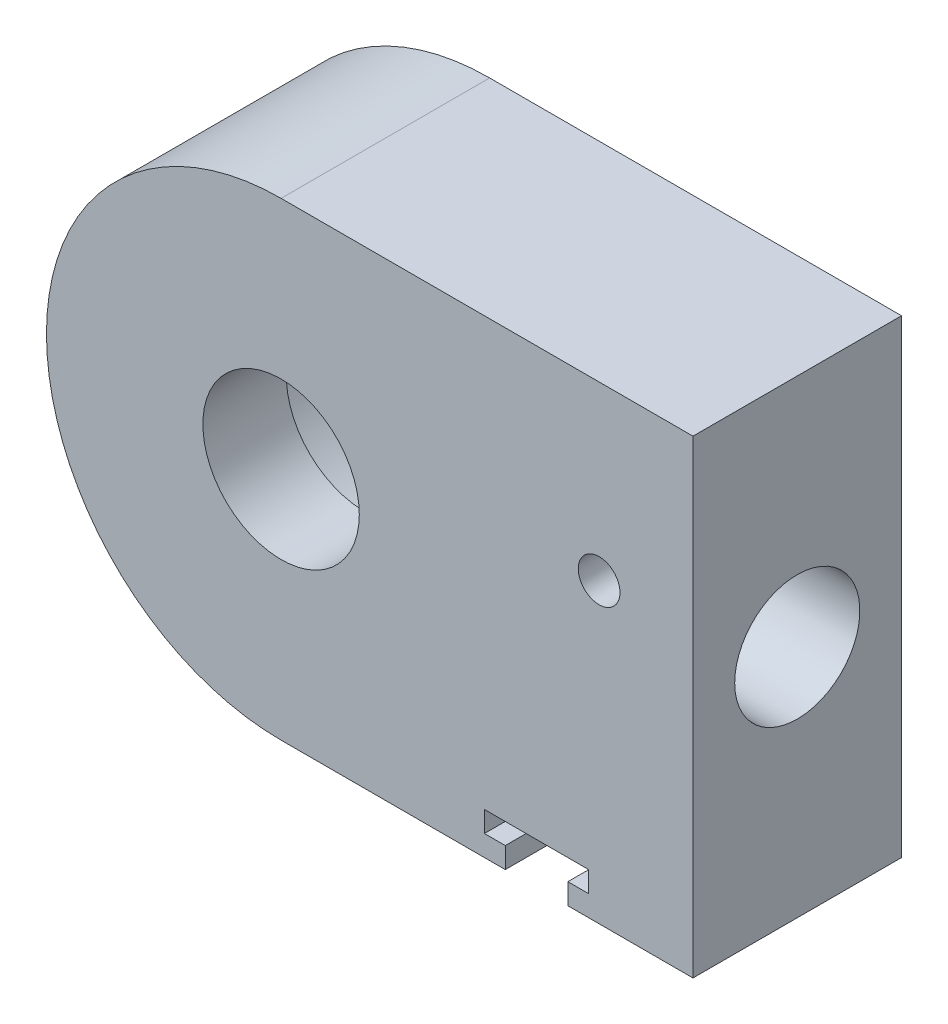
ISO-10303-21;
HEADER;
FILE_DESCRIPTION(('STEP AP214'),'2;1');
FILE_NAME('part.step','',(''),(''),'','','');
FILE_SCHEMA(('AUTOMOTIVE_DESIGN { 1 0 10303 214 1 1 1 1 }'));
ENDSEC;
DATA;
#1=APPLICATION_CONTEXT('core data for automotive mechanical design processes');
#2=APPLICATION_PROTOCOL_DEFINITION('international standard','automotive_design',2000,#1);
#3=PRODUCT_CONTEXT('',#1,'mechanical');
#4=PRODUCT('Part','Part','',(#3));
#5=PRODUCT_RELATED_PRODUCT_CATEGORY('part','',(#4));
#6=PRODUCT_DEFINITION_FORMATION('','',#4);
#7=PRODUCT_DEFINITION_CONTEXT('part definition',#1,'design');
#8=PRODUCT_DEFINITION('design','',#6,#7);
#9=PRODUCT_DEFINITION_SHAPE('','',#8);
#10=(LENGTH_UNIT() NAMED_UNIT(*) SI_UNIT(.MILLI.,.METRE.));
#11=(NAMED_UNIT(*) PLANE_ANGLE_UNIT() SI_UNIT($,.RADIAN.));
#12=(NAMED_UNIT(*) SI_UNIT($,.STERADIAN.) SOLID_ANGLE_UNIT());
#13=UNCERTAINTY_MEASURE_WITH_UNIT(LENGTH_MEASURE(1.E-05),#10,'distance_accuracy_value','');
#14=(GEOMETRIC_REPRESENTATION_CONTEXT(3) GLOBAL_UNCERTAINTY_ASSIGNED_CONTEXT((#13)) GLOBAL_UNIT_ASSIGNED_CONTEXT((#10,
#11,#12)) REPRESENTATION_CONTEXT('',''));
#15=CARTESIAN_POINT('',(0.,0.,0.));
#16=DIRECTION('',(0.,0.,1.));
#17=DIRECTION('',(1.,0.,0.));
#18=AXIS2_PLACEMENT_3D('',#15,#16,#17);
#19=CARTESIAN_POINT('',(-634.508066615171,-2.49999999999969,10.));
#20=DIRECTION('',(0.,0.,1.));
#21=DIRECTION('',(1.,0.,0.));
#22=AXIS2_PLACEMENT_3D('',#19,#20,#21);
#23=PLANE('',#22);
#24=CARTESIAN_POINT('',(-604.008671928237,3.50000000000032,10.));
#25=DIRECTION('',(0.,0.,1.));
#26=DIRECTION('',(1.,0.,0.));
#27=AXIS2_PLACEMENT_3D('',#24,#25,#26);
#28=CIRCLE('',#27,2.);
#29=CARTESIAN_POINT('',(-602.008671928237,3.50000000000032,10.));
#30=VERTEX_POINT('',#29);
#31=EDGE_CURVE('E205',#30,#30,#28,.T.);
#32=ORIENTED_EDGE('',*,*,#31,.F.);
#33=EDGE_LOOP('',(#32));
#34=FACE_BOUND('',#33,.T.);
#35=CARTESIAN_POINT('',(-634.508066615171,-2.49999999999969,10.));
#36=DIRECTION('',(0.,0.,1.));
#37=DIRECTION('',(1.,0.,0.));
#38=AXIS2_PLACEMENT_3D('',#35,#36,#37);
#39=CIRCLE('',#38,7.49999999999996);
#40=CARTESIAN_POINT('',(-627.008066615171,-2.49999999999969,10.));
#41=VERTEX_POINT('',#40);
#42=EDGE_CURVE('E235',#41,#41,#39,.T.);
#43=ORIENTED_EDGE('',*,*,#42,.F.);
#44=EDGE_LOOP('',(#43));
#45=FACE_BOUND('',#44,.T.);
#46=DIRECTION('',(1.,0.,0.));
#47=VECTOR('',#46,1.);
#48=CARTESIAN_POINT('',(0.,-22.9999999999982,10.));
#49=LINE('',#48,#47);
#50=CARTESIAN_POINT('',(-607.008671928237,-22.9999999999993,10.));
#51=VERTEX_POINT('',#50);
#52=CARTESIAN_POINT('',(-605.008671928237,-22.9999999999993,10.));
#53=VERTEX_POINT('',#52);
#54=EDGE_CURVE('E158',#51,#53,#49,.T.);
#55=ORIENTED_EDGE('',*,*,#54,.F.);
#56=DIRECTION('',(0.,-1.,0.));
#57=VECTOR('',#56,1.);
#58=CARTESIAN_POINT('',(-607.008671928237,0.,10.));
#59=LINE('',#58,#57);
#60=CARTESIAN_POINT('',(-607.008671928237,-24.9999999999993,10.));
#61=VERTEX_POINT('',#60);
#62=EDGE_CURVE('E168',#51,#61,#59,.T.);
#63=ORIENTED_EDGE('',*,*,#62,.T.);
#64=DIRECTION('',(-1.,0.,0.));
#65=VECTOR('',#64,1.);
#66=CARTESIAN_POINT('',(-595.008671928237,-24.9999999999993,10.));
#67=LINE('',#66,#65);
#68=CARTESIAN_POINT('',(-595.008671928237,-24.9999999999993,10.));
#69=VERTEX_POINT('',#68);
#70=EDGE_CURVE('E245',#69,#61,#67,.T.);
#71=ORIENTED_EDGE('',*,*,#70,.F.);
#72=DIRECTION('',(0.,-1.,0.));
#73=VECTOR('',#72,1.);
#74=CARTESIAN_POINT('',(-595.008671928237,19.9999999999999,10.));
#75=LINE('',#74,#73);
#76=CARTESIAN_POINT('',(-595.008671928237,19.9999999999999,10.));
#77=VERTEX_POINT('',#76);
#78=EDGE_CURVE('E241',#77,#69,#75,.T.);
#79=ORIENTED_EDGE('',*,*,#78,.F.);
#80=DIRECTION('',(1.,0.,0.));
#81=VECTOR('',#80,1.);
#82=CARTESIAN_POINT('',(-634.508066615171,19.9999999999999,10.));
#83=LINE('',#82,#81);
#84=CARTESIAN_POINT('',(-634.508066615171,19.9999999999999,10.));
#85=VERTEX_POINT('',#84);
#86=EDGE_CURVE('E239',#85,#77,#83,.T.);
#87=ORIENTED_EDGE('',*,*,#86,.F.);
#88=CARTESIAN_POINT('',(-634.508066615171,-2.49999999999969,10.));
#89=DIRECTION('',(0.,0.,1.));
#90=DIRECTION('',(1.,0.,0.));
#91=AXIS2_PLACEMENT_3D('',#88,#89,#90);
#92=CIRCLE('',#91,22.4999999999996);
#93=CARTESIAN_POINT('',(-634.508066615171,-24.9999999999993,10.));
#94=VERTEX_POINT('',#93);
#95=EDGE_CURVE('E247',#85,#94,#92,.T.);
#96=ORIENTED_EDGE('',*,*,#95,.T.);
#97=CARTESIAN_POINT('',(-613.008671928237,-24.9999999999993,10.));
#98=VERTEX_POINT('',#97);
#99=EDGE_CURVE('E244',#98,#94,#67,.T.);
#100=ORIENTED_EDGE('',*,*,#99,.F.);
#101=DIRECTION('',(0.,1.,0.));
#102=VECTOR('',#101,1.);
#103=CARTESIAN_POINT('',(-613.008671928237,0.,10.));
#104=LINE('',#103,#102);
#105=CARTESIAN_POINT('',(-613.008671928237,-22.9999999999993,10.));
#106=VERTEX_POINT('',#105);
#107=EDGE_CURVE('E73',#98,#106,#104,.T.);
#108=ORIENTED_EDGE('',*,*,#107,.T.);
#109=DIRECTION('',(-1.,0.,0.));
#110=VECTOR('',#109,1.);
#111=CARTESIAN_POINT('',(0.,-22.9999999999993,10.));
#112=LINE('',#111,#110);
#113=CARTESIAN_POINT('',(-615.008671928237,-22.9999999999993,10.));
#114=VERTEX_POINT('',#113);
#115=EDGE_CURVE('E187',#106,#114,#112,.T.);
#116=ORIENTED_EDGE('',*,*,#115,.T.);
#117=DIRECTION('',(0.,1.,0.));
#118=VECTOR('',#117,1.);
#119=CARTESIAN_POINT('',(-615.008671928237,0.,10.));
#120=LINE('',#119,#118);
#121=CARTESIAN_POINT('',(-615.008671928237,-20.9999999999993,10.));
#122=VERTEX_POINT('',#121);
#123=EDGE_CURVE('E184',#114,#122,#120,.T.);
#124=ORIENTED_EDGE('',*,*,#123,.T.);
#125=DIRECTION('',(1.,0.,0.));
#126=VECTOR('',#125,1.);
#127=CARTESIAN_POINT('',(0.,-20.999999999999,10.));
#128=LINE('',#127,#126);
#129=CARTESIAN_POINT('',(-605.008671928237,-20.9999999999993,10.));
#130=VERTEX_POINT('',#129);
#131=EDGE_CURVE('E180',#122,#130,#128,.T.);
#132=ORIENTED_EDGE('',*,*,#131,.T.);
#133=DIRECTION('',(0.,1.,0.));
#134=VECTOR('',#133,1.);
#135=CARTESIAN_POINT('',(-605.008671928237,0.,10.));
#136=LINE('',#135,#134);
#137=EDGE_CURVE('E178',#53,#130,#136,.T.);
#138=ORIENTED_EDGE('',*,*,#137,.F.);
#139=EDGE_LOOP('',(#55,#63,#71,#79,#87,#96,#100,#108,#116,#124,#132,#138));
#140=FACE_BOUND('',#139,.T.);
#141=ADVANCED_FACE('F51',(#34,#45,#140),#23,.T.);
#142=CARTESIAN_POINT('',(-634.508066615171,-2.49999999999969,-10.));
#143=DIRECTION('',(0.,0.,1.));
#144=DIRECTION('',(1.,0.,0.));
#145=AXIS2_PLACEMENT_3D('',#142,#143,#144);
#146=PLANE('',#145);
#147=CARTESIAN_POINT('',(-634.508066615171,-2.49999999999969,-10.));
#148=DIRECTION('',(0.,0.,1.));
#149=DIRECTION('',(1.,0.,0.));
#150=AXIS2_PLACEMENT_3D('',#147,#148,#149);
#151=CIRCLE('',#150,14.);
#152=CARTESIAN_POINT('',(-620.508066615171,-2.49999999999969,-10.));
#153=VERTEX_POINT('',#152);
#154=EDGE_CURVE('E222',#153,#153,#151,.T.);
#155=ORIENTED_EDGE('',*,*,#154,.T.);
#156=EDGE_LOOP('',(#155));
#157=FACE_BOUND('',#156,.T.);
#158=CARTESIAN_POINT('',(-604.008671928237,3.50000000000032,-10.));
#159=DIRECTION('',(0.,0.,1.));
#160=DIRECTION('',(1.,0.,0.));
#161=AXIS2_PLACEMENT_3D('',#158,#159,#160);
#162=CIRCLE('',#161,2.);
#163=CARTESIAN_POINT('',(-602.008671928237,3.50000000000032,-10.));
#164=VERTEX_POINT('',#163);
#165=EDGE_CURVE('E219',#164,#164,#162,.T.);
#166=ORIENTED_EDGE('',*,*,#165,.T.);
#167=EDGE_LOOP('',(#166));
#168=FACE_BOUND('',#167,.T.);
#169=DIRECTION('',(0.,-1.,0.));
#170=VECTOR('',#169,1.);
#171=CARTESIAN_POINT('',(-607.008671928237,0.,-10.));
#172=LINE('',#171,#170);
#173=CARTESIAN_POINT('',(-607.008671928237,-22.9999999999993,-10.));
#174=VERTEX_POINT('',#173);
#175=CARTESIAN_POINT('',(-607.008671928237,-24.9999999999993,-10.));
#176=VERTEX_POINT('',#175);
#177=EDGE_CURVE('E191',#174,#176,#172,.T.);
#178=ORIENTED_EDGE('',*,*,#177,.F.);
#179=DIRECTION('',(1.,0.,0.));
#180=VECTOR('',#179,1.);
#181=CARTESIAN_POINT('',(0.,-22.9999999999982,-10.));
#182=LINE('',#181,#180);
#183=CARTESIAN_POINT('',(-605.008671928237,-22.9999999999993,-10.));
#184=VERTEX_POINT('',#183);
#185=EDGE_CURVE('E161',#174,#184,#182,.T.);
#186=ORIENTED_EDGE('',*,*,#185,.T.);
#187=DIRECTION('',(0.,1.,0.));
#188=VECTOR('',#187,1.);
#189=CARTESIAN_POINT('',(-605.008671928237,0.,-10.));
#190=LINE('',#189,#188);
#191=CARTESIAN_POINT('',(-605.008671928237,-20.9999999999993,-10.));
#192=VERTEX_POINT('',#191);
#193=EDGE_CURVE('E194',#184,#192,#190,.T.);
#194=ORIENTED_EDGE('',*,*,#193,.T.);
#195=DIRECTION('',(1.,0.,0.));
#196=VECTOR('',#195,1.);
#197=CARTESIAN_POINT('',(0.,-20.999999999999,-10.));
#198=LINE('',#197,#196);
#199=CARTESIAN_POINT('',(-615.008671928237,-20.9999999999993,-10.));
#200=VERTEX_POINT('',#199);
#201=EDGE_CURVE('E197',#200,#192,#198,.T.);
#202=ORIENTED_EDGE('',*,*,#201,.F.);
#203=DIRECTION('',(0.,1.,0.));
#204=VECTOR('',#203,1.);
#205=CARTESIAN_POINT('',(-615.008671928237,0.,-10.));
#206=LINE('',#205,#204);
#207=CARTESIAN_POINT('',(-615.008671928237,-22.9999999999993,-10.));
#208=VERTEX_POINT('',#207);
#209=EDGE_CURVE('E199',#208,#200,#206,.T.);
#210=ORIENTED_EDGE('',*,*,#209,.F.);
#211=DIRECTION('',(-1.,0.,0.));
#212=VECTOR('',#211,1.);
#213=CARTESIAN_POINT('',(0.,-22.9999999999993,-10.));
#214=LINE('',#213,#212);
#215=CARTESIAN_POINT('',(-613.008671928237,-22.9999999999993,-10.));
#216=VERTEX_POINT('',#215);
#217=EDGE_CURVE('E201',#216,#208,#214,.T.);
#218=ORIENTED_EDGE('',*,*,#217,.F.);
#219=DIRECTION('',(0.,1.,0.));
#220=VECTOR('',#219,1.);
#221=CARTESIAN_POINT('',(-613.008671928237,0.,-10.));
#222=LINE('',#221,#220);
#223=CARTESIAN_POINT('',(-613.008671928237,-24.9999999999993,-10.));
#224=VERTEX_POINT('',#223);
#225=EDGE_CURVE('E165',#224,#216,#222,.T.);
#226=ORIENTED_EDGE('',*,*,#225,.F.);
#227=DIRECTION('',(-1.,0.,0.));
#228=VECTOR('',#227,1.);
#229=CARTESIAN_POINT('',(-595.008671928237,-24.9999999999993,-10.));
#230=LINE('',#229,#228);
#231=CARTESIAN_POINT('',(-634.508066615171,-24.9999999999993,-10.));
#232=VERTEX_POINT('',#231);
#233=EDGE_CURVE('E255',#224,#232,#230,.T.);
#234=ORIENTED_EDGE('',*,*,#233,.T.);
#235=CARTESIAN_POINT('',(-634.508066615171,-2.49999999999969,-10.));
#236=DIRECTION('',(0.,0.,1.));
#237=DIRECTION('',(1.,0.,0.));
#238=AXIS2_PLACEMENT_3D('',#235,#236,#237);
#239=CIRCLE('',#238,22.4999999999996);
#240=CARTESIAN_POINT('',(-634.508066615171,19.9999999999999,-10.));
#241=VERTEX_POINT('',#240);
#242=EDGE_CURVE('E242',#241,#232,#239,.T.);
#243=ORIENTED_EDGE('',*,*,#242,.F.);
#244=DIRECTION('',(1.,0.,0.));
#245=VECTOR('',#244,1.);
#246=CARTESIAN_POINT('',(-634.508066615171,19.9999999999999,-10.));
#247=LINE('',#246,#245);
#248=CARTESIAN_POINT('',(-595.008671928237,19.9999999999999,-10.));
#249=VERTEX_POINT('',#248);
#250=EDGE_CURVE('E238',#241,#249,#247,.T.);
#251=ORIENTED_EDGE('',*,*,#250,.T.);
#252=DIRECTION('',(0.,-1.,0.));
#253=VECTOR('',#252,1.);
#254=CARTESIAN_POINT('',(-595.008671928237,19.9999999999999,-10.));
#255=LINE('',#254,#253);
#256=CARTESIAN_POINT('',(-595.008671928237,-24.9999999999993,-10.));
#257=VERTEX_POINT('',#256);
#258=EDGE_CURVE('E252',#249,#257,#255,.T.);
#259=ORIENTED_EDGE('',*,*,#258,.T.);
#260=EDGE_CURVE('E256',#257,#176,#230,.T.);
#261=ORIENTED_EDGE('',*,*,#260,.T.);
#262=EDGE_LOOP('',(#178,#186,#194,#202,#210,#218,#226,#234,#243,#251,#259,#261));
#263=FACE_BOUND('',#262,.T.);
#264=ADVANCED_FACE('F279',(#157,#168,#263),#146,.F.);
#265=CARTESIAN_POINT('',(-595.008671928237,-24.9999999999993,10.));
#266=DIRECTION('',(0.,-1.,0.));
#267=DIRECTION('',(1.,0.,0.));
#268=AXIS2_PLACEMENT_3D('',#265,#266,#267);
#269=PLANE('',#268);
#270=ORIENTED_EDGE('',*,*,#70,.T.);
#271=DIRECTION('',(0.,0.,1.));
#272=VECTOR('',#271,1.);
#273=CARTESIAN_POINT('',(-607.008671928237,-24.9999999999993,-10.));
#274=LINE('',#273,#272);
#275=EDGE_CURVE('E171',#176,#61,#274,.T.);
#276=ORIENTED_EDGE('',*,*,#275,.F.);
#277=ORIENTED_EDGE('',*,*,#260,.F.);
#278=DIRECTION('',(0.,0.,-1.));
#279=VECTOR('',#278,1.);
#280=CARTESIAN_POINT('',(-595.008671928237,-24.9999999999993,10.));
#281=LINE('',#280,#279);
#282=EDGE_CURVE('E262',#69,#257,#281,.T.);
#283=ORIENTED_EDGE('',*,*,#282,.F.);
#284=EDGE_LOOP('',(#270,#276,#277,#283));
#285=FACE_BOUND('',#284,.T.);
#286=ADVANCED_FACE('F285',(#285),#269,.T.);
#287=ORIENTED_EDGE('',*,*,#233,.F.);
#288=DIRECTION('',(0.,0.,1.));
#289=VECTOR('',#288,1.);
#290=CARTESIAN_POINT('',(-613.008671928237,-24.9999999999993,-10.));
#291=LINE('',#290,#289);
#292=EDGE_CURVE('E206',#224,#98,#291,.T.);
#293=ORIENTED_EDGE('',*,*,#292,.T.);
#294=ORIENTED_EDGE('',*,*,#99,.T.);
#295=DIRECTION('',(0.,0.,-1.));
#296=VECTOR('',#295,1.);
#297=CARTESIAN_POINT('',(-634.508066615171,-24.9999999999993,10.));
#298=LINE('',#297,#296);
#299=EDGE_CURVE('E65',#94,#232,#298,.T.);
#300=ORIENTED_EDGE('',*,*,#299,.T.);
#301=EDGE_LOOP('',(#287,#293,#294,#300));
#302=FACE_BOUND('',#301,.T.);
#303=ADVANCED_FACE('F295',(#302),#269,.T.);
#304=CARTESIAN_POINT('',(-634.508066615171,19.9999999999999,10.));
#305=DIRECTION('',(0.,1.,0.));
#306=DIRECTION('',(0.,0.,1.));
#307=AXIS2_PLACEMENT_3D('',#304,#305,#306);
#308=PLANE('',#307);
#309=ORIENTED_EDGE('',*,*,#250,.F.);
#310=DIRECTION('',(0.,0.,-1.));
#311=VECTOR('',#310,1.);
#312=CARTESIAN_POINT('',(-634.508066615171,19.9999999999999,10.));
#313=LINE('',#312,#311);
#314=EDGE_CURVE('E12',#85,#241,#313,.T.);
#315=ORIENTED_EDGE('',*,*,#314,.F.);
#316=ORIENTED_EDGE('',*,*,#86,.T.);
#317=DIRECTION('',(0.,0.,-1.));
#318=VECTOR('',#317,1.);
#319=CARTESIAN_POINT('',(-595.008671928237,19.9999999999999,10.));
#320=LINE('',#319,#318);
#321=EDGE_CURVE('E106',#77,#249,#320,.T.);
#322=ORIENTED_EDGE('',*,*,#321,.T.);
#323=EDGE_LOOP('',(#309,#315,#316,#322));
#324=FACE_BOUND('',#323,.T.);
#325=ADVANCED_FACE('F53',(#324),#308,.T.);
#326=CARTESIAN_POINT('',(-634.508066615171,-2.49999999999969,10.));
#327=DIRECTION('',(0.,0.,-1.));
#328=DIRECTION('',(-1.,0.,0.));
#329=AXIS2_PLACEMENT_3D('',#326,#327,#328);
#330=CYLINDRICAL_SURFACE('',#329,22.4999999999996);
#331=ORIENTED_EDGE('',*,*,#242,.T.);
#332=ORIENTED_EDGE('',*,*,#299,.F.);
#333=ORIENTED_EDGE('',*,*,#95,.F.);
#334=ORIENTED_EDGE('',*,*,#314,.T.);
#335=EDGE_LOOP('',(#331,#332,#333,#334));
#336=FACE_BOUND('',#335,.T.);
#337=ADVANCED_FACE('F291',(#336),#330,.T.);
#338=CARTESIAN_POINT('',(-595.008671928237,19.9999999999999,10.));
#339=DIRECTION('',(1.,0.,0.));
#340=DIRECTION('',(0.,0.,-1.));
#341=AXIS2_PLACEMENT_3D('',#338,#339,#340);
#342=PLANE('',#341);
#343=CARTESIAN_POINT('',(-595.008671928237,-2.49999999999969,0.));
#344=DIRECTION('',(-1.,0.,0.));
#345=DIRECTION('',(0.,0.,1.));
#346=AXIS2_PLACEMENT_3D('',#343,#344,#345);
#347=CIRCLE('',#346,6.00000000000001);
#348=CARTESIAN_POINT('',(-595.008671928237,-2.49999999999969,6.00000000000001));
#349=VERTEX_POINT('',#348);
#350=EDGE_CURVE('E229',#349,#349,#347,.T.);
#351=ORIENTED_EDGE('',*,*,#350,.T.);
#352=EDGE_LOOP('',(#351));
#353=FACE_BOUND('',#352,.T.);
#354=ORIENTED_EDGE('',*,*,#258,.F.);
#355=ORIENTED_EDGE('',*,*,#321,.F.);
#356=ORIENTED_EDGE('',*,*,#78,.T.);
#357=ORIENTED_EDGE('',*,*,#282,.T.);
#358=EDGE_LOOP('',(#354,#355,#356,#357));
#359=FACE_BOUND('',#358,.T.);
#360=ADVANCED_FACE('F274',(#353,#359),#342,.T.);
#361=CARTESIAN_POINT('',(-634.508066615171,-2.49999999999969,10.));
#362=DIRECTION('',(0.,0.,-1.));
#363=DIRECTION('',(-1.,0.,0.));
#364=AXIS2_PLACEMENT_3D('',#361,#362,#363);
#365=CYLINDRICAL_SURFACE('',#364,7.49999999999996);
#366=CARTESIAN_POINT('',(-634.508066615171,-2.49999999999969,2.));
#367=DIRECTION('',(0.,0.,1.));
#368=DIRECTION('',(1.,0.,0.));
#369=AXIS2_PLACEMENT_3D('',#366,#367,#368);
#370=CIRCLE('',#369,7.49999999999996);
#371=CARTESIAN_POINT('',(-627.008066615171,-2.49999999999969,2.));
#372=VERTEX_POINT('',#371);
#373=EDGE_CURVE('E228',#372,#372,#370,.T.);
#374=ORIENTED_EDGE('',*,*,#373,.F.);
#375=EDGE_LOOP('',(#374));
#376=FACE_BOUND('',#375,.T.);
#377=ORIENTED_EDGE('',*,*,#42,.T.);
#378=EDGE_LOOP('',(#377));
#379=FACE_BOUND('',#378,.T.);
#380=ADVANCED_FACE('F270',(#376,#379),#365,.F.);
#381=CARTESIAN_POINT('',(-612.008671928237,-2.49999999999969,0.));
#382=DIRECTION('',(-1.,0.,0.));
#383=DIRECTION('',(0.,0.,1.));
#384=AXIS2_PLACEMENT_3D('',#381,#382,#383);
#385=PLANE('',#384);
#386=CARTESIAN_POINT('',(-612.008671928237,-2.49999999999969,0.));
#387=DIRECTION('',(-1.,0.,0.));
#388=DIRECTION('',(0.,0.,1.));
#389=AXIS2_PLACEMENT_3D('',#386,#387,#388);
#390=CIRCLE('',#389,6.00000000000001);
#391=CARTESIAN_POINT('',(-612.008671928237,-2.49999999999969,6.00000000000001));
#392=VERTEX_POINT('',#391);
#393=EDGE_CURVE('E232',#392,#392,#390,.T.);
#394=ORIENTED_EDGE('',*,*,#393,.F.);
#395=EDGE_LOOP('',(#394));
#396=FACE_BOUND('',#395,.T.);
#397=ADVANCED_FACE('F273',(#396),#385,.F.);
#398=CARTESIAN_POINT('',(-666.113025571018,-2.49999999999969,0.));
#399=DIRECTION('',(-1.,0.,0.));
#400=DIRECTION('',(0.,0.,1.));
#401=AXIS2_PLACEMENT_3D('',#398,#399,#400);
#402=CYLINDRICAL_SURFACE('',#401,6.00000000000001);
#403=CARTESIAN_POINT('',(-602.008671928237,3.50000000000032,0.));
#404=CARTESIAN_POINT('',(-602.008674236148,3.50000034205196,0.168404625428711));
#405=CARTESIAN_POINT('',(-602.008634884061,3.49290641783626,0.336801575679913));
#406=CARTESIAN_POINT('',(-602.008934966189,3.46457415462165,0.67248448953632));
#407=CARTESIAN_POINT('',(-602.009274572881,3.4433293768382,0.839769912373839));
#408=CARTESIAN_POINT('',(-602.011677423404,3.38681157645678,1.17213591901359));
#409=CARTESIAN_POINT('',(-602.013742628198,3.3515226180078,1.33721377721103));
#410=CARTESIAN_POINT('',(-602.021814532794,3.26719702898689,1.66367838894613));
#411=CARTESIAN_POINT('',(-602.027819235826,3.21816737022652,1.82506696956701));
#412=CARTESIAN_POINT('',(-602.043491278391,3.12666990439746,2.086229448696));
#413=CARTESIAN_POINT('',(-602.051095513519,3.08807345216627,2.1874965512854));
#414=CARTESIAN_POINT('',(-602.070278185055,3.00560622509883,2.3874647843065));
#415=CARTESIAN_POINT('',(-602.081855597946,2.96173681049957,2.48616656854283));
#416=CARTESIAN_POINT('',(-602.110159132702,2.86913655005333,2.6802811784473));
#417=CARTESIAN_POINT('',(-602.12687485363,2.82041565801858,2.77570021908406));
#418=CARTESIAN_POINT('',(-602.166830902239,2.7185849237655,2.96272001071977));
#419=CARTESIAN_POINT('',(-602.190068567439,2.66547687876325,3.05432230235765));
#420=CARTESIAN_POINT('',(-602.254082752954,2.53653574067951,3.26392373056457));
#421=CARTESIAN_POINT('',(-602.298147268396,2.45921210733965,3.38005187229782));
#422=CARTESIAN_POINT('',(-602.404956617582,2.30118669948619,3.60096634426211));
#423=CARTESIAN_POINT('',(-602.467676910383,2.22048948191002,3.70576732951828));
#424=CARTESIAN_POINT('',(-602.597804798067,2.08003265069607,3.87718348797675));
#425=CARTESIAN_POINT('',(-602.660562275891,2.01985171257043,3.94695667488873));
#426=CARTESIAN_POINT('',(-602.799886920084,1.90406477652339,4.07574327922136));
#427=CARTESIAN_POINT('',(-602.876437148985,1.84845328794078,4.13476971685851));
#428=CARTESIAN_POINT('',(-603.029512500796,1.75415600420293,4.23154625592695));
#429=CARTESIAN_POINT('',(-603.104041770216,1.71418732201139,4.27119323806358));
#430=CARTESIAN_POINT('',(-603.261460548453,1.64281672107886,4.3404548874414));
#431=CARTESIAN_POINT('',(-603.344347919185,1.61141261901179,4.37007211198537));
#432=CARTESIAN_POINT('',(-603.516903354336,1.559298924713,4.41852692583143));
#433=CARTESIAN_POINT('',(-603.606601444924,1.53864026822178,4.43731321891362));
#434=CARTESIAN_POINT('',(-603.789626478347,1.50987709822598,4.46332542081476));
#435=CARTESIAN_POINT('',(-603.882952378762,1.50176900536101,4.470554625679));
#436=CARTESIAN_POINT('',(-604.061915945222,1.49887981805983,4.47313701185764));
#437=CARTESIAN_POINT('',(-604.147525251839,1.50301355568609,4.46945718498281));
#438=CARTESIAN_POINT('',(-604.316530718968,1.52200867225344,4.45237100575788));
#439=CARTESIAN_POINT('',(-604.399927347396,1.53686776404599,4.43896672711388));
#440=CARTESIAN_POINT('',(-604.561354494127,1.5761048664466,4.40296040445153));
#441=CARTESIAN_POINT('',(-604.639432978894,1.60037905634381,4.38045856867576));
#442=CARTESIAN_POINT('',(-604.789439309588,1.6569497734008,4.32680969530759));
#443=CARTESIAN_POINT('',(-604.861366189234,1.68924755779043,4.2956613027825));
#444=CARTESIAN_POINT('',(-605.00287318657,1.76265313431491,4.22287060458482));
#445=CARTESIAN_POINT('',(-605.071897119646,1.80423244248087,4.18062750615882));
#446=CARTESIAN_POINT('',(-605.200804007686,1.89222951541363,4.0880815486084));
#447=CARTESIAN_POINT('',(-605.260682029577,1.93864986876335,4.03777436969224));
#448=CARTESIAN_POINT('',(-605.398173230339,2.05740667360314,3.90402222723651));
#449=CARTESIAN_POINT('',(-605.47027121673,2.13137806614303,3.81635135690242));
#450=CARTESIAN_POINT('',(-605.596199054552,2.27963983092469,3.62896545254279));
#451=CARTESIAN_POINT('',(-605.649988704163,2.3539305469937,3.52922455714428));
#452=CARTESIAN_POINT('',(-605.730600274869,2.48064613221888,3.34697325406761));
#453=CARTESIAN_POINT('',(-605.760802209048,2.53386381364579,3.26645391073399));
#454=CARTESIAN_POINT('',(-605.813991856031,2.63732563875096,3.10119126774797));
#455=CARTESIAN_POINT('',(-605.836975885881,2.68756825381876,3.0164458371953));
#456=CARTESIAN_POINT('',(-605.877012598935,2.78442045653861,2.84337092651659));
#457=CARTESIAN_POINT('',(-605.894054644461,2.83102341373796,2.75503533143639));
#458=CARTESIAN_POINT('',(-605.923311738639,2.92004552488899,2.57549153579485));
#459=CARTESIAN_POINT('',(-605.935525244181,2.96246333810337,2.48428242695135));
#460=CARTESIAN_POINT('',(-605.961634582917,3.06412814906897,2.25039079946921));
#461=CARTESIAN_POINT('',(-605.972978472287,3.12034745596764,2.10609945490037));
#462=CARTESIAN_POINT('',(-605.989855618658,3.22154403649079,1.81327516403384));
#463=CARTESIAN_POINT('',(-605.99538598841,3.26651571560791,1.66474014772082));
#464=CARTESIAN_POINT('',(-606.003032866055,3.3448432362811,1.36450782768776));
#465=CARTESIAN_POINT('',(-606.00514823582,3.37819520239728,1.21280948677112));
#466=CARTESIAN_POINT('',(-606.007738813103,3.43303351284988,0.907302829965305));
#467=CARTESIAN_POINT('',(-606.008214291766,3.45452181826753,0.753494867110308));
#468=CARTESIAN_POINT('',(-606.008686416362,3.48593582849968,0.440443638946744));
#469=CARTESIAN_POINT('',(-606.008669593243,3.49552878573337,0.281166872207317));
#470=CARTESIAN_POINT('',(-606.00867350011,3.50200026833398,-0.037657946133702));
#471=CARTESIAN_POINT('',(-606.008694233376,3.49887768318638,-0.197206020213596));
#472=CARTESIAN_POINT('',(-606.008593496566,3.47993249647332,-0.515610004230071));
#473=CARTESIAN_POINT('',(-606.008471968928,3.46410475498098,-0.674465607868733));
#474=CARTESIAN_POINT('',(-606.007188059013,3.41984442146911,-0.990392335951926));
#475=CARTESIAN_POINT('',(-606.006025824461,3.39141361870956,-1.14746371045858));
#476=CARTESIAN_POINT('',(-606.001394543621,3.32695737902952,-1.43715838336217));
#477=CARTESIAN_POINT('',(-605.9982685246,3.29253646524748,-1.57014573696719));
#478=CARTESIAN_POINT('',(-605.988605281306,3.21468368271699,-1.83336487209152));
#479=CARTESIAN_POINT('',(-605.982067607354,3.17125062656337,-1.96359628800491));
#480=CARTESIAN_POINT('',(-605.963766887694,3.07578104051984,-2.22021522961452));
#481=CARTESIAN_POINT('',(-605.952014673389,3.02376248397129,-2.34661014587314));
#482=CARTESIAN_POINT('',(-605.921057001779,2.91164229116666,-2.59473809040948));
#483=CARTESIAN_POINT('',(-605.901856325398,2.85154585597335,-2.71647405416012));
#484=CARTESIAN_POINT('',(-605.849614249601,2.71443612441429,-2.97214743785992));
#485=CARTESIAN_POINT('',(-605.814918612073,2.63623896432189,-3.10514520012177));
#486=CARTESIAN_POINT('',(-605.749237276406,2.51381489235722,-3.29657898764228));
#487=CARTESIAN_POINT('',(-605.725076095114,2.47216010779092,-3.35903592066635));
#488=CARTESIAN_POINT('',(-605.671565023641,2.38766466284798,-3.48083655579336));
#489=CARTESIAN_POINT('',(-605.642216346287,2.34482428163222,-3.54018098139911));
#490=CARTESIAN_POINT('',(-605.559553860564,2.23436041908273,-3.68759982779276));
#491=CARTESIAN_POINT('',(-605.502037069103,2.16632887120981,-3.77309454392911));
#492=CARTESIAN_POINT('',(-605.370814003929,2.0325858681495,-3.93274529762757));
#493=CARTESIAN_POINT('',(-605.297131169414,1.96687121217983,-4.00691749040431));
#494=CARTESIAN_POINT('',(-605.149551255573,1.85527495183693,-4.12758100919712));
#495=CARTESIAN_POINT('',(-605.078755409149,1.80808014857938,-4.17663323145692));
#496=CARTESIAN_POINT('',(-604.926914978014,1.72110472824781,-4.264516295972));
#497=CARTESIAN_POINT('',(-604.845873640706,1.68132177176036,-4.30335036500092));
#498=CARTESIAN_POINT('',(-604.674552354635,1.61182722669046,-4.3698082320745));
#499=CARTESIAN_POINT('',(-604.584216275974,1.58218214031763,-4.39735823350907));
#500=CARTESIAN_POINT('',(-604.397464163014,1.53580099054536,-4.43996884353481));
#501=CARTESIAN_POINT('',(-604.301051031698,1.51905881328154,-4.45503536750295));
#502=CARTESIAN_POINT('',(-604.11663186736,1.50101088581756,-4.47124527189334));
#503=CARTESIAN_POINT('',(-604.028889945926,1.49818955577622,-4.47375608378581));
#504=CARTESIAN_POINT('',(-603.854122353322,1.50406670080163,-4.4684972580857));
#505=CARTESIAN_POINT('',(-603.767096452255,1.5127613205819,-4.46073106101025));
#506=CARTESIAN_POINT('',(-603.599725202493,1.54048918078787,-4.43562537221815));
#507=CARTESIAN_POINT('',(-603.519251675547,1.55910631646898,-4.41867075018883));
#508=CARTESIAN_POINT('',(-603.363401131273,1.60520910021185,-4.37587038660188));
#509=CARTESIAN_POINT('',(-603.288024291699,1.63269505739311,-4.35002433513468));
#510=CARTESIAN_POINT('',(-603.140405683857,1.69642396282851,-4.28859705204998));
#511=CARTESIAN_POINT('',(-603.068490792657,1.73302552186621,-4.25260618026159));
#512=CARTESIAN_POINT('',(-602.932975395135,1.81208848310954,-4.17241765664991));
#513=CARTESIAN_POINT('',(-602.869379131058,1.85455285265613,-4.12821584508971));
#514=CARTESIAN_POINT('',(-602.72648249617,1.96152703693572,-4.01287879644432));
#515=CARTESIAN_POINT('',(-602.65148918749,2.02791782298843,-3.93814535100363));
#516=CARTESIAN_POINT('',(-602.51805242292,2.16316378503962,-3.77703572009069));
#517=CARTESIAN_POINT('',(-602.459639646674,2.23202326731442,-3.69063838254922));
#518=CARTESIAN_POINT('',(-602.371589240797,2.3494579160377,-3.53405410826166));
#519=CARTESIAN_POINT('',(-602.338463771392,2.39836374008245,-3.46601418262405));
#520=CARTESIAN_POINT('',(-602.27886397477,2.49453150383592,-3.32593867994933));
#521=CARTESIAN_POINT('',(-602.252392706762,2.54179267886096,-3.25390128362202));
#522=CARTESIAN_POINT('',(-602.205138203485,2.63400015082132,-3.10638489949444));
#523=CARTESIAN_POINT('',(-602.184365514079,2.67894203256251,-3.03089982840251));
#524=CARTESIAN_POINT('',(-602.147660825407,2.76592620510489,-2.87712247208463));
#525=CARTESIAN_POINT('',(-602.131730457237,2.80796751519444,-2.79882925086276));
#526=CARTESIAN_POINT('',(-602.095855192433,2.91205266398426,-2.59410929461702));
#527=CARTESIAN_POINT('',(-602.078880042846,2.97167600296535,-2.46592408607893));
#528=CARTESIAN_POINT('',(-602.052031291406,3.0819402224599,-2.20500391405614));
#529=CARTESIAN_POINT('',(-602.042162084832,3.13257552899477,-2.07226618775677));
#530=CARTESIAN_POINT('',(-602.02721198071,3.22435796598568,-1.8033062332933));
#531=CARTESIAN_POINT('',(-602.022130927402,3.26550540505164,-1.66708411862536));
#532=CARTESIAN_POINT('',(-602.014911042899,3.33801395355528,-1.39205603675036));
#533=CARTESIAN_POINT('',(-602.012771177104,3.36937850124623,-1.25325099554338));
#534=CARTESIAN_POINT('',(-602.009576354232,3.43041399456604,-0.93006392694578));
#535=CARTESIAN_POINT('',(-602.009069064562,3.4564957153712,-0.744988530408243));
#536=CARTESIAN_POINT('',(-602.008615646996,3.49128622923233,-0.373271995357697));
#537=CARTESIAN_POINT('',(-602.008669370536,3.49999962092796,-0.186631284441708));
#538=CARTESIAN_POINT('',(-602.008671928237,3.50000000000032,0.));
#539=B_SPLINE_CURVE_WITH_KNOTS('',3,(#403,#404,#405,#406,#407,#408,#409,#410,#411,#412,#413,
#414,#415,#416,#417,#418,#419,#420,#421,#422,#423,#424,#425,#426,#427,#428,#429,#430,#431,#432,
#433,#434,#435,#436,#437,#438,#439,#440,#441,#442,#443,#444,#445,#446,#447,#448,#449,#450,#451,
#452,#453,#454,#455,#456,#457,#458,#459,#460,#461,#462,#463,#464,#465,#466,#467,#468,#469,#470,
#471,#472,#473,#474,#475,#476,#477,#478,#479,#480,#481,#482,#483,#484,#485,#486,#487,#488,#489,
#490,#491,#492,#493,#494,#495,#496,#497,#498,#499,#500,#501,#502,#503,#504,#505,#506,#507,#508,
#509,#510,#511,#512,#513,#514,#515,#516,#517,#518,#519,#520,#521,#522,#523,#524,#525,#526,#527,
#528,#529,#530,#531,#532,#533,#534,#535,#536,#537,#538),.UNSPECIFIED.,.T.,.F.,(4,2,2,2,2,2,2,2,
2,2,2,2,2,2,2,2,2,2,2,2,2,2,2,2,2,2,2,2,2,2,2,2,2,2,2,2,2,2,2,2,2,2,2,2,2,2,2,2,2,2,2,2,2,2,2,2,
2,2,2,2,2,2,2,2,2,2,2,4),(0.,0.50505235962759,1.01033468042019,1.51619198435083,
2.02179308761278,2.34751526391298,2.67315359507073,2.99813706361599,3.32298805527878,
3.76057072668945,4.197580301989,4.53081193794175,4.86363712104112,5.14266651063176,
5.4216247020078,5.70189343406632,5.98208222009339,6.23819793290857,6.4942590459712,
6.74757335360547,7.00092737852652,7.27280723746337,7.54483322757185,7.94900689018079,
8.3540624049501,8.65705372115561,8.96019938923987,9.26388501250384,9.56766760962363,
10.0327998683078,10.4981630231276,10.9636812389476,11.4291224808387,11.9073094972678,
12.3855382771545,12.863960624162,13.3423150711629,13.7541919099508,14.166123050543,
14.5772025233912,14.9880185732253,15.460974346887,15.6973671228902,15.9337047035808,
16.3027542688317,16.6712722430328,16.9647204420618,17.2580758620525,17.5533202874426,
17.8484247292005,18.1105604225564,18.3726083808311,18.6244442226783,18.876288843119,
19.1402880603935,19.4044213886438,19.7772484910128,20.1507610195081,20.4207149371803,
20.6907927376841,20.9613670267499,21.2320323557907,21.6585405187642,22.0853122660278,
22.5120701298157,22.9386778376609,23.4985409486948,24.0582558041963),.UNSPECIFIED.);
#540=CARTESIAN_POINT('',(-602.008671928237,3.50000000000032,0.));
#541=VERTEX_POINT('',#540);
#542=EDGE_CURVE('E55',#541,#541,#539,.T.);
#543=ORIENTED_EDGE('',*,*,#542,.F.);
#544=EDGE_LOOP('',(#543));
#545=FACE_BOUND('',#544,.T.);
#546=ORIENTED_EDGE('',*,*,#393,.T.);
#547=EDGE_LOOP('',(#546));
#548=FACE_BOUND('',#547,.T.);
#549=ORIENTED_EDGE('',*,*,#350,.F.);
#550=EDGE_LOOP('',(#549));
#551=FACE_BOUND('',#550,.T.);
#552=ADVANCED_FACE('F356',(#545,#548,#551),#402,.F.);
#553=CARTESIAN_POINT('',(-634.508066615171,-2.49999999999969,2.));
#554=DIRECTION('',(0.,0.,-1.));
#555=DIRECTION('',(-1.,0.,0.));
#556=AXIS2_PLACEMENT_3D('',#553,#554,#555);
#557=CYLINDRICAL_SURFACE('',#556,14.);
#558=CARTESIAN_POINT('',(-634.508066615171,-2.49999999999969,2.));
#559=DIRECTION('',(0.,0.,1.));
#560=DIRECTION('',(1.,0.,0.));
#561=AXIS2_PLACEMENT_3D('',#558,#559,#560);
#562=CIRCLE('',#561,14.);
#563=CARTESIAN_POINT('',(-620.508066615171,-2.49999999999969,2.));
#564=VERTEX_POINT('',#563);
#565=EDGE_CURVE('E225',#564,#564,#562,.T.);
#566=ORIENTED_EDGE('',*,*,#565,.T.);
#567=EDGE_LOOP('',(#566));
#568=FACE_BOUND('',#567,.T.);
#569=ORIENTED_EDGE('',*,*,#154,.F.);
#570=EDGE_LOOP('',(#569));
#571=FACE_BOUND('',#570,.T.);
#572=ADVANCED_FACE('F370',(#568,#571),#557,.F.);
#573=CARTESIAN_POINT('',(-634.508066615171,-2.49999999999969,2.));
#574=DIRECTION('',(0.,0.,1.));
#575=DIRECTION('',(1.,0.,0.));
#576=AXIS2_PLACEMENT_3D('',#573,#574,#575);
#577=PLANE('',#576);
#578=ORIENTED_EDGE('',*,*,#373,.T.);
#579=EDGE_LOOP('',(#578));
#580=FACE_BOUND('',#579,.T.);
#581=ORIENTED_EDGE('',*,*,#565,.F.);
#582=EDGE_LOOP('',(#581));
#583=FACE_BOUND('',#582,.T.);
#584=ADVANCED_FACE('F267',(#580,#583),#577,.F.);
#585=CARTESIAN_POINT('',(-604.008671928237,3.50000000000032,-10.));
#586=DIRECTION('',(0.,0.,1.));
#587=DIRECTION('',(1.,0.,0.));
#588=AXIS2_PLACEMENT_3D('',#585,#586,#587);
#589=CYLINDRICAL_SURFACE('',#588,2.);
#590=ORIENTED_EDGE('',*,*,#542,.T.);
#591=EDGE_LOOP('',(#590));
#592=FACE_BOUND('',#591,.T.);
#593=ORIENTED_EDGE('',*,*,#165,.F.);
#594=EDGE_LOOP('',(#593));
#595=FACE_BOUND('',#594,.T.);
#596=ORIENTED_EDGE('',*,*,#31,.T.);
#597=EDGE_LOOP('',(#596));
#598=FACE_BOUND('',#597,.T.);
#599=ADVANCED_FACE('F385',(#592,#595,#598),#589,.F.);
#600=CARTESIAN_POINT('',(-607.008671928237,0.,-10.));
#601=DIRECTION('',(-1.,0.,0.));
#602=DIRECTION('',(0.,0.,1.));
#603=AXIS2_PLACEMENT_3D('',#600,#601,#602);
#604=PLANE('',#603);
#605=DIRECTION('',(0.,0.,1.));
#606=VECTOR('',#605,1.);
#607=CARTESIAN_POINT('',(-607.008671928237,-22.9999999999993,-10.));
#608=LINE('',#607,#606);
#609=EDGE_CURVE('E154',#174,#51,#608,.T.);
#610=ORIENTED_EDGE('',*,*,#609,.F.);
#611=ORIENTED_EDGE('',*,*,#177,.T.);
#612=ORIENTED_EDGE('',*,*,#275,.T.);
#613=ORIENTED_EDGE('',*,*,#62,.F.);
#614=EDGE_LOOP('',(#610,#611,#612,#613));
#615=FACE_BOUND('',#614,.T.);
#616=ADVANCED_FACE('F169',(#615),#604,.T.);
#617=CARTESIAN_POINT('',(-613.008671928237,0.,-10.));
#618=DIRECTION('',(1.,0.,0.));
#619=DIRECTION('',(0.,0.,-1.));
#620=AXIS2_PLACEMENT_3D('',#617,#618,#619);
#621=PLANE('',#620);
#622=ORIENTED_EDGE('',*,*,#292,.F.);
#623=ORIENTED_EDGE('',*,*,#225,.T.);
#624=DIRECTION('',(0.,0.,1.));
#625=VECTOR('',#624,1.);
#626=CARTESIAN_POINT('',(-613.008671928237,-22.9999999999993,-10.));
#627=LINE('',#626,#625);
#628=EDGE_CURVE('E208',#216,#106,#627,.T.);
#629=ORIENTED_EDGE('',*,*,#628,.T.);
#630=ORIENTED_EDGE('',*,*,#107,.F.);
#631=EDGE_LOOP('',(#622,#623,#629,#630));
#632=FACE_BOUND('',#631,.T.);
#633=ADVANCED_FACE('F328',(#632),#621,.T.);
#634=CARTESIAN_POINT('',(0.,-22.9999999999993,-10.));
#635=DIRECTION('',(0.,1.,0.));
#636=DIRECTION('',(0.,0.,1.));
#637=AXIS2_PLACEMENT_3D('',#634,#635,#636);
#638=PLANE('',#637);
#639=ORIENTED_EDGE('',*,*,#628,.F.);
#640=ORIENTED_EDGE('',*,*,#217,.T.);
#641=DIRECTION('',(0.,0.,1.));
#642=VECTOR('',#641,1.);
#643=CARTESIAN_POINT('',(-615.008671928237,-22.9999999999993,-10.));
#644=LINE('',#643,#642);
#645=EDGE_CURVE('E210',#208,#114,#644,.T.);
#646=ORIENTED_EDGE('',*,*,#645,.T.);
#647=ORIENTED_EDGE('',*,*,#115,.F.);
#648=EDGE_LOOP('',(#639,#640,#646,#647));
#649=FACE_BOUND('',#648,.T.);
#650=ADVANCED_FACE('F326',(#649),#638,.T.);
#651=CARTESIAN_POINT('',(-615.008671928237,0.,-10.));
#652=DIRECTION('',(1.,0.,0.));
#653=DIRECTION('',(0.,0.,-1.));
#654=AXIS2_PLACEMENT_3D('',#651,#652,#653);
#655=PLANE('',#654);
#656=ORIENTED_EDGE('',*,*,#645,.F.);
#657=ORIENTED_EDGE('',*,*,#209,.T.);
#658=DIRECTION('',(0.,0.,1.));
#659=VECTOR('',#658,1.);
#660=CARTESIAN_POINT('',(-615.008671928237,-20.9999999999993,-10.));
#661=LINE('',#660,#659);
#662=EDGE_CURVE('E212',#200,#122,#661,.T.);
#663=ORIENTED_EDGE('',*,*,#662,.T.);
#664=ORIENTED_EDGE('',*,*,#123,.F.);
#665=EDGE_LOOP('',(#656,#657,#663,#664));
#666=FACE_BOUND('',#665,.T.);
#667=ADVANCED_FACE('F320',(#666),#655,.T.);
#668=CARTESIAN_POINT('',(0.,-20.999999999999,-10.));
#669=DIRECTION('',(0.,-1.,0.));
#670=DIRECTION('',(1.,0.,0.));
#671=AXIS2_PLACEMENT_3D('',#668,#669,#670);
#672=PLANE('',#671);
#673=ORIENTED_EDGE('',*,*,#662,.F.);
#674=ORIENTED_EDGE('',*,*,#201,.T.);
#675=DIRECTION('',(0.,0.,1.));
#676=VECTOR('',#675,1.);
#677=CARTESIAN_POINT('',(-605.008671928237,-20.9999999999993,-10.));
#678=LINE('',#677,#676);
#679=EDGE_CURVE('E214',#192,#130,#678,.T.);
#680=ORIENTED_EDGE('',*,*,#679,.T.);
#681=ORIENTED_EDGE('',*,*,#131,.F.);
#682=EDGE_LOOP('',(#673,#674,#680,#681));
#683=FACE_BOUND('',#682,.T.);
#684=ADVANCED_FACE('F316',(#683),#672,.T.);
#685=CARTESIAN_POINT('',(-605.008671928237,0.,-10.));
#686=DIRECTION('',(1.,0.,0.));
#687=DIRECTION('',(0.,0.,-1.));
#688=AXIS2_PLACEMENT_3D('',#685,#686,#687);
#689=PLANE('',#688);
#690=ORIENTED_EDGE('',*,*,#679,.F.);
#691=ORIENTED_EDGE('',*,*,#193,.F.);
#692=DIRECTION('',(0.,0.,1.));
#693=VECTOR('',#692,1.);
#694=CARTESIAN_POINT('',(-605.008671928237,-22.9999999999993,-10.));
#695=LINE('',#694,#693);
#696=EDGE_CURVE('E164',#184,#53,#695,.T.);
#697=ORIENTED_EDGE('',*,*,#696,.T.);
#698=ORIENTED_EDGE('',*,*,#137,.T.);
#699=EDGE_LOOP('',(#690,#691,#697,#698));
#700=FACE_BOUND('',#699,.T.);
#701=ADVANCED_FACE('F312',(#700),#689,.F.);
#702=CARTESIAN_POINT('',(0.,-22.9999999999982,-10.));
#703=DIRECTION('',(0.,-1.,0.));
#704=DIRECTION('',(1.,0.,0.));
#705=AXIS2_PLACEMENT_3D('',#702,#703,#704);
#706=PLANE('',#705);
#707=ORIENTED_EDGE('',*,*,#696,.F.);
#708=ORIENTED_EDGE('',*,*,#185,.F.);
#709=ORIENTED_EDGE('',*,*,#609,.T.);
#710=ORIENTED_EDGE('',*,*,#54,.T.);
#711=EDGE_LOOP('',(#707,#708,#709,#710));
#712=FACE_BOUND('',#711,.T.);
#713=ADVANCED_FACE('F156',(#712),#706,.F.);
#714=CLOSED_SHELL('',(#141,#264,#286,#303,#325,#337,#360,#380,#397,#552,#572,#584,#599,#616,
#633,#650,#667,#684,#701,#713));
#715=MANIFOLD_SOLID_BREP('B2',#714);
#716=ADVANCED_BREP_SHAPE_REPRESENTATION('',(#18,#715),#14);
#717=SHAPE_DEFINITION_REPRESENTATION(#9,#716);
ENDSEC;
END-ISO-10303-21;
